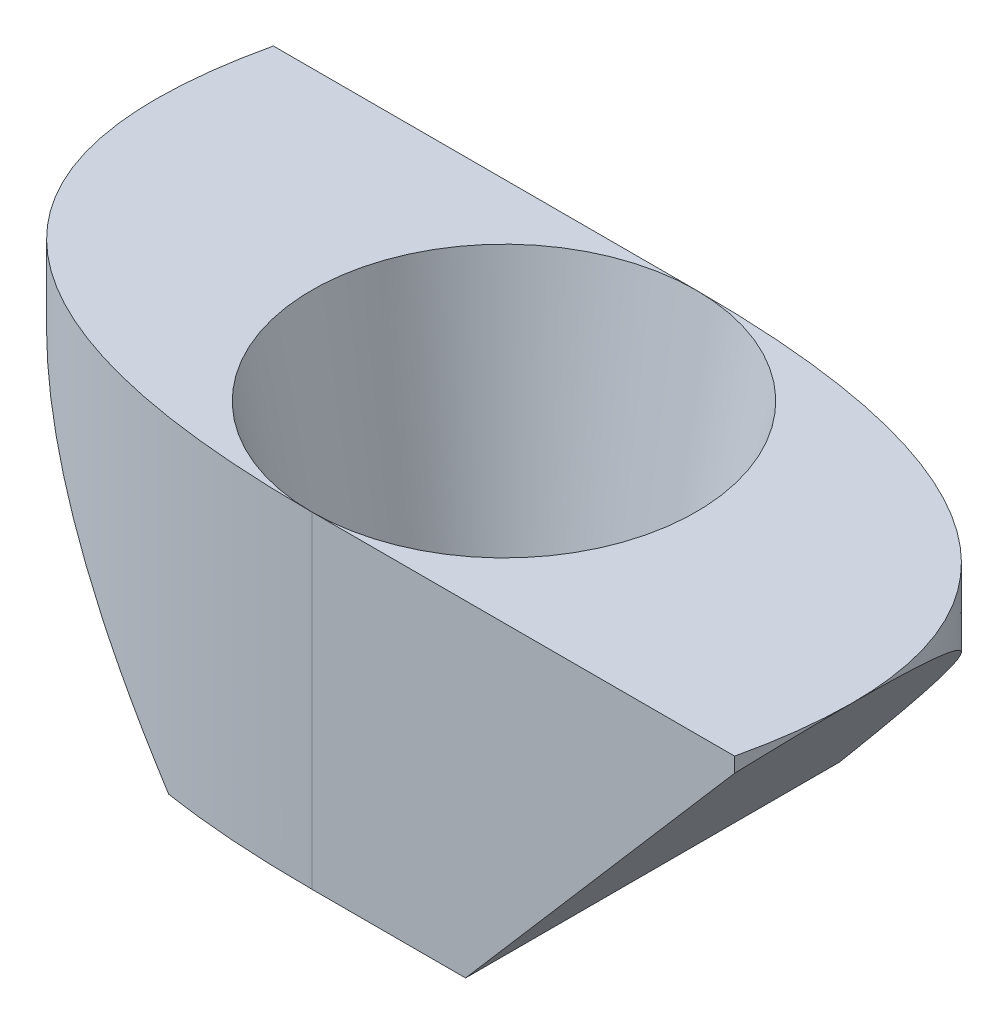
ISO-10303-21;
HEADER;
FILE_DESCRIPTION(('STEP AP214'),'2;1');
FILE_NAME('part.step','',(''),(''),'','','');
FILE_SCHEMA(('AUTOMOTIVE_DESIGN { 1 0 10303 214 1 1 1 1 }'));
ENDSEC;
DATA;
#1=APPLICATION_CONTEXT('core data for automotive mechanical design processes');
#2=APPLICATION_PROTOCOL_DEFINITION('international standard','automotive_design',2000,#1);
#3=PRODUCT_CONTEXT('',#1,'mechanical');
#4=PRODUCT('Part','Part','',(#3));
#5=PRODUCT_RELATED_PRODUCT_CATEGORY('part','',(#4));
#6=PRODUCT_DEFINITION_FORMATION('','',#4);
#7=PRODUCT_DEFINITION_CONTEXT('part definition',#1,'design');
#8=PRODUCT_DEFINITION('design','',#6,#7);
#9=PRODUCT_DEFINITION_SHAPE('','',#8);
#10=(LENGTH_UNIT() NAMED_UNIT(*) SI_UNIT(.MILLI.,.METRE.));
#11=(NAMED_UNIT(*) PLANE_ANGLE_UNIT() SI_UNIT($,.RADIAN.));
#12=(NAMED_UNIT(*) SI_UNIT($,.STERADIAN.) SOLID_ANGLE_UNIT());
#13=UNCERTAINTY_MEASURE_WITH_UNIT(LENGTH_MEASURE(1.E-05),#10,'distance_accuracy_value','');
#14=(GEOMETRIC_REPRESENTATION_CONTEXT(3) GLOBAL_UNCERTAINTY_ASSIGNED_CONTEXT((#13)) GLOBAL_UNIT_ASSIGNED_CONTEXT((#10,
#11,#12)) REPRESENTATION_CONTEXT('',''));
#15=CARTESIAN_POINT('',(0.,0.,0.));
#16=DIRECTION('',(0.,0.,1.));
#17=DIRECTION('',(1.,0.,0.));
#18=AXIS2_PLACEMENT_3D('',#15,#16,#17);
#19=CARTESIAN_POINT('',(1.02364660851406,7.62,-1.58527253873093));
#20=DIRECTION('',(0.,1.,0.));
#21=DIRECTION('',(0.,0.,1.));
#22=AXIS2_PLACEMENT_3D('',#19,#20,#21);
#23=PLANE('',#22);
#24=CARTESIAN_POINT('',(6.985,7.62,-3.175));
#25=DIRECTION('',(0.,1.,0.));
#26=DIRECTION('',(0.,0.,1.));
#27=AXIS2_PLACEMENT_3D('',#24,#25,#26);
#28=CIRCLE('',#27,3.175);
#29=CARTESIAN_POINT('',(6.985,7.62,0.));
#30=VERTEX_POINT('',#29);
#31=CARTESIAN_POINT('',(6.985,7.62,-6.35));
#32=VERTEX_POINT('',#31);
#33=EDGE_CURVE('E102',#30,#32,#28,.T.);
#34=ORIENTED_EDGE('',*,*,#33,.F.);
#35=DIRECTION('',(1.,0.,0.));
#36=VECTOR('',#35,1.);
#37=CARTESIAN_POINT('',(6.985,7.62,0.));
#38=LINE('',#37,#36);
#39=CARTESIAN_POINT('',(13.97,7.62,0.));
#40=VERTEX_POINT('',#39);
#41=EDGE_CURVE('E115',#30,#40,#38,.T.);
#42=ORIENTED_EDGE('',*,*,#41,.T.);
#43=CARTESIAN_POINT('',(6.985,7.62,-6.35));
#44=CARTESIAN_POINT('',(15.4152067829719,7.62,-6.35445492253815));
#45=CARTESIAN_POINT('',(13.97,7.62,0.));
#46=B_SPLINE_CURVE_WITH_KNOTS('',2,(#43,#44,#45),.UNSPECIFIED.,.F.,.F.,(3,3),(0.,1.),.UNSPECIFIED.);
#47=CARTESIAN_POINT('',(14.1814972331641,7.62,-1.72367732330045));
#48=VERTEX_POINT('',#47);
#49=EDGE_CURVE('E149',#48,#40,#46,.T.);
#50=ORIENTED_EDGE('',*,*,#49,.F.);
#51=EDGE_CURVE('E118',#32,#48,#46,.T.);
#52=ORIENTED_EDGE('',*,*,#51,.F.);
#53=EDGE_LOOP('',(#34,#42,#50,#52));
#54=FACE_BOUND('',#53,.T.);
#55=ADVANCED_FACE('F39',(#54),#23,.T.);
#56=CARTESIAN_POINT('',(6.985,7.62,0.));
#57=CARTESIAN_POINT('',(-1.44520678297188,7.62,0.00445492253814571));
#58=CARTESIAN_POINT('',(0.,7.62,-6.35));
#59=B_SPLINE_CURVE_WITH_KNOTS('',2,(#56,#57,#58),.UNSPECIFIED.,.F.,.F.,(3,3),(0.,1.),.UNSPECIFIED.);
#60=DIRECTION('',(0.,-1.,0.));
#61=VECTOR('',#60,1.);
#62=SURFACE_OF_LINEAR_EXTRUSION('',#59,#61);
#63=CARTESIAN_POINT('',(4.4449999999907,2.22250000000322,-0.175813019659384));
#64=CARTESIAN_POINT('',(4.33611285150209,2.34871469627836,-0.192801383492369));
#65=CARTESIAN_POINT('',(4.2273198373901,2.47482027828033,-0.211282842349697));
#66=CARTESIAN_POINT('',(4.00961120651582,2.72717355506995,-0.25166564757652));
#67=CARTESIAN_POINT('',(3.90069654144772,2.85342014671736,-0.273578981611049));
#68=CARTESIAN_POINT('',(3.68298833800999,3.10577292804928,-0.321192206364467));
#69=CARTESIAN_POINT('',(3.57419551608388,3.23187828728039,-0.346899835043656));
#70=CARTESIAN_POINT('',(3.35698480896471,3.48365440417063,-0.402539518381535));
#71=CARTESIAN_POINT('',(3.2485672683031,3.60932476247196,-0.432474743476806));
#72=CARTESIAN_POINT('',(3.03069251355806,3.86187059893477,-0.497576945506983));
#73=CARTESIAN_POINT('',(2.92124447650136,3.98873543970097,-0.532816396972029));
#74=CARTESIAN_POINT('',(2.70326055147626,4.24140781904727,-0.60881780132445));
#75=CARTESIAN_POINT('',(2.59472397227606,4.36721615885703,-0.64957507316884));
#76=CARTESIAN_POINT('',(2.37885733957723,4.61743431461875,-0.737393145668664));
#77=CARTESIAN_POINT('',(2.27152615457931,4.741845442129,-0.784447384936697));
#78=CARTESIAN_POINT('',(2.0583893655255,4.98889934580678,-0.885835805511238));
#79=CARTESIAN_POINT('',(1.95258294852688,5.11154306428313,-0.940165935573852));
#80=CARTESIAN_POINT('',(1.77081844199807,5.32223231735557,-1.04174394035354));
#81=CARTESIAN_POINT('',(1.69439560777923,5.41081655289605,-1.08704103295699));
#82=CARTESIAN_POINT('',(1.54291594039176,5.58640164696649,-1.18276042634278));
#83=CARTESIAN_POINT('',(1.4678592173731,5.67340237781798,-1.23318313826584));
#84=CARTESIAN_POINT('',(1.31950913666771,5.84535986442498,-1.33975475856979));
#85=CARTESIAN_POINT('',(1.24621542517321,5.93031703029078,-1.39590250597795));
#86=CARTESIAN_POINT('',(1.10186525418845,6.09763808920632,-1.51461396658386));
#87=CARTESIAN_POINT('',(1.03080878602798,6.18000199230597,-1.57717765491333));
#88=CARTESIAN_POINT('',(0.89055697007189,6.34257251231648,-1.7104047177679));
#89=CARTESIAN_POINT('',(0.821403641730782,6.42273042308743,-1.78117253361704));
#90=CARTESIAN_POINT('',(0.686898928429221,6.5786392862721,-1.93080787251836));
#91=CARTESIAN_POINT('',(0.621547979361351,6.65438973342831,-2.00967632134664));
#92=CARTESIAN_POINT('',(0.495917245409161,6.80001247355956,-2.175865932437));
#93=CARTESIAN_POINT('',(0.435622606437337,6.86990198439886,-2.26316058987801));
#94=CARTESIAN_POINT('',(0.321157798839941,7.00258192987521,-2.44669797594878));
#95=CARTESIAN_POINT('',(0.266983998264478,7.06537657442554,-2.54293533575892));
#96=CARTESIAN_POINT('',(0.18146110953869,7.16450898421413,-2.7134774073111));
#97=CARTESIAN_POINT('',(0.148186958924518,7.20307815304361,-2.78553005247946));
#98=CARTESIAN_POINT('',(0.0856544563667786,7.27556164560354,-2.93360137460022));
#99=CARTESIAN_POINT('',(0.0563950508124339,7.30947719060909,-3.00961900374553));
#100=CARTESIAN_POINT('',(0.00225209664267992,7.37223608007001,-3.16518378385871));
#101=CARTESIAN_POINT('',(-0.0226333506328952,7.40108162532521,-3.24472938452242));
#102=CARTESIAN_POINT('',(-0.0678025312377718,7.4534387169559,-3.40682987961406));
#103=CARTESIAN_POINT('',(-0.0880861041550688,7.47695007739253,-3.48938487882712));
#104=CARTESIAN_POINT('',(-0.123914413113531,7.51847985566148,-3.65671393622461));
#105=CARTESIAN_POINT('',(-0.139466956832929,7.53650732363196,-3.74148408482895));
#106=CARTESIAN_POINT('',(-0.165916205581268,7.56716552291154,-3.91270038737645));
#107=CARTESIAN_POINT('',(-0.176812932592585,7.57979627970114,-3.9991465334044));
#108=CARTESIAN_POINT('',(-0.194123042906617,7.59986100125935,-4.17316449668132));
#109=CARTESIAN_POINT('',(-0.200531872063575,7.60728968716693,-4.26073736580889));
#110=CARTESIAN_POINT('',(-0.209110690893473,7.61723367989704,-4.43639889542608));
#111=CARTESIAN_POINT('',(-0.211278365156075,7.61974630285085,-4.52448781134119));
#112=CARTESIAN_POINT('',(-0.211785162669914,7.62033374861619,-4.74439763703106));
#113=CARTESIAN_POINT('',(-0.207691896346679,7.615589108198,-4.87623726905798));
#114=CARTESIAN_POINT('',(-0.19186481550894,7.59724341517079,-5.1388506906859));
#115=CARTESIAN_POINT('',(-0.180126125614932,7.58363671134808,-5.26962374623088));
#116=CARTESIAN_POINT('',(-0.150119205945933,7.54885469800124,-5.52945421678254));
#117=CARTESIAN_POINT('',(-0.131846782233135,7.52767452714505,-5.65851047447848));
#118=CARTESIAN_POINT('',(-0.0897792108768285,7.478912613409,-5.91442721480851));
#119=CARTESIAN_POINT('',(-0.0659856555646899,7.45133271625313,-6.04128831922539));
#120=CARTESIAN_POINT('',(-0.027106344513439,7.4062664205181,-6.22827298303603));
#121=CARTESIAN_POINT('',(-0.0138074153761489,7.39085119176906,-6.28927847906629));
#122=CARTESIAN_POINT('',(0.,7.37484655979763,-6.35));
#123=B_SPLINE_CURVE_WITH_KNOTS('',3,(#63,#64,#65,#66,#67,#68,#69,#70,#71,#72,#73,#74,#75,#76,
#77,#78,#79,#80,#81,#82,#83,#84,#85,#86,#87,#88,#89,#90,#91,#92,#93,#94,#95,#96,#97,#98,#99,
#100,#101,#102,#103,#104,#105,#106,#107,#108,#109,#110,#111,#112,#113,#114,#115,#116,#117,#118,
#119,#120,#121,#122),.UNSPECIFIED.,.F.,.F.,(4,2,2,2,2,2,2,2,2,2,2,2,2,2,2,2,2,2,2,2,2,2,2,2,2,2,
2,2,2,4),(0.,0.502674562163052,1.00714584520608,1.51266052175297,2.01855633638888,
2.53212633488433,3.04526334497855,3.55786977439832,4.07019196017935,4.44646021362518,
4.82275867248424,5.19898097344792,5.57520181622328,5.95688683527895,6.33861552362211,
6.71918035088728,7.09951816136753,7.36396634879362,7.62834500240083,7.89260860881417,
8.1568814255059,8.42071571324087,8.68454875527207,8.9486491384505,9.21289366404602,
9.60820991462832,10.0037784999898,10.3996014539869,10.7953103915663,10.9882172906008),.UNSPECIFIED.);
#124=CARTESIAN_POINT('',(4.445,2.2225,-0.175813019658626));
#125=VERTEX_POINT('',#124);
#126=CARTESIAN_POINT('',(-0.211497233164059,7.62,-4.62632267670126));
#127=VERTEX_POINT('',#126);
#128=EDGE_CURVE('E189',#125,#127,#123,.T.);
#129=ORIENTED_EDGE('',*,*,#128,.F.);
#130=CARTESIAN_POINT('',(6.985,2.2225,0.));
#131=CARTESIAN_POINT('',(-1.44520678297188,2.2225,0.00445492253814571));
#132=CARTESIAN_POINT('',(0.,2.2225,-6.35));
#133=B_SPLINE_CURVE_WITH_KNOTS('',2,(#130,#131,#132),.UNSPECIFIED.,.F.,.F.,(3,3),(0.,1.),.UNSPECIFIED.);
#134=CARTESIAN_POINT('',(6.985,2.2225,0.));
#135=VERTEX_POINT('',#134);
#136=EDGE_CURVE('E131',#135,#125,#133,.T.);
#137=ORIENTED_EDGE('',*,*,#136,.F.);
#138=DIRECTION('',(0.,-1.,0.));
#139=VECTOR('',#138,1.);
#140=CARTESIAN_POINT('',(6.985,7.62,0.));
#141=LINE('',#140,#139);
#142=EDGE_CURVE('E126',#30,#135,#141,.T.);
#143=ORIENTED_EDGE('',*,*,#142,.F.);
#144=EDGE_CURVE('E129',#30,#127,#59,.T.);
#145=ORIENTED_EDGE('',*,*,#144,.T.);
#146=EDGE_LOOP('',(#129,#137,#143,#145));
#147=FACE_BOUND('',#146,.T.);
#148=ADVANCED_FACE('F128',(#147),#62,.T.);
#149=DIRECTION('',(0.,-1.,0.));
#150=VECTOR('',#149,1.);
#151=SURFACE_OF_LINEAR_EXTRUSION('',#46,#150);
#152=CARTESIAN_POINT('',(9.52500000000929,2.22250000000322,-6.17418698034061));
#153=CARTESIAN_POINT('',(9.63388714849791,2.34871469627836,-6.15719861650763));
#154=CARTESIAN_POINT('',(9.7426801626099,2.47482027828033,-6.1387171576503));
#155=CARTESIAN_POINT('',(9.96038879348418,2.72717355506994,-6.09833435242348));
#156=CARTESIAN_POINT('',(10.0693034585523,2.85342014671736,-6.07642101838895));
#157=CARTESIAN_POINT('',(10.28701166199,3.10577292804928,-6.02880779363553));
#158=CARTESIAN_POINT('',(10.3958044839161,3.23187828728038,-6.00310016495634));
#159=CARTESIAN_POINT('',(10.6130151910353,3.48365440417063,-5.94746048161846));
#160=CARTESIAN_POINT('',(10.7214327316969,3.60932476247195,-5.91752525652319));
#161=CARTESIAN_POINT('',(10.9393074864419,3.86187059893477,-5.85242305449302));
#162=CARTESIAN_POINT('',(11.0487555234986,3.98873543970097,-5.81718360302797));
#163=CARTESIAN_POINT('',(11.2667394485237,4.24140781904727,-5.74118219867555));
#164=CARTESIAN_POINT('',(11.3752760277239,4.36721615885702,-5.70042492683116));
#165=CARTESIAN_POINT('',(11.5911426604228,4.61743431461875,-5.61260685433133));
#166=CARTESIAN_POINT('',(11.6984738454207,4.741845442129,-5.5655526150633));
#167=CARTESIAN_POINT('',(11.9116106344745,4.98889934580678,-5.46416419448876));
#168=CARTESIAN_POINT('',(12.0174170514731,5.11154306428313,-5.40983406442615));
#169=CARTESIAN_POINT('',(12.1991815580019,5.32223231735556,-5.30825605964646));
#170=CARTESIAN_POINT('',(12.2756043922208,5.41081655289604,-5.26295896704301));
#171=CARTESIAN_POINT('',(12.4270840596082,5.58640164696648,-5.16723957365721));
#172=CARTESIAN_POINT('',(12.5021407826269,5.67340237781798,-5.11681686173416));
#173=CARTESIAN_POINT('',(12.6504908633323,5.84535986442498,-5.0102452414302));
#174=CARTESIAN_POINT('',(12.7237845748268,5.93031703029077,-4.95409749402205));
#175=CARTESIAN_POINT('',(12.8681347458115,6.09763808920631,-4.83538603341614));
#176=CARTESIAN_POINT('',(12.939191213972,6.18000199230597,-4.77282234508666));
#177=CARTESIAN_POINT('',(13.0794430299281,6.34257251231648,-4.63959528223209));
#178=CARTESIAN_POINT('',(13.1485963582692,6.42273042308742,-4.56882746638296));
#179=CARTESIAN_POINT('',(13.2831010715708,6.5786392862721,-4.41919212748164));
#180=CARTESIAN_POINT('',(13.3484520206386,6.65438973342831,-4.34032367865336));
#181=CARTESIAN_POINT('',(13.4740827545908,6.80001247355955,-4.17413406756299));
#182=CARTESIAN_POINT('',(13.5343773935627,6.86990198439886,-4.08683941012199));
#183=CARTESIAN_POINT('',(13.6488422011601,7.00258192987521,-3.90330202405122));
#184=CARTESIAN_POINT('',(13.7030160017355,7.06537657442554,-3.80706466424108));
#185=CARTESIAN_POINT('',(13.7885388904613,7.16450898421412,-3.6365225926889));
#186=CARTESIAN_POINT('',(13.8218130410755,7.20307815304361,-3.56446994752054));
#187=CARTESIAN_POINT('',(13.8843455436332,7.27556164560353,-3.41639862539978));
#188=CARTESIAN_POINT('',(13.9136049491876,7.30947719060908,-3.34038099625448));
#189=CARTESIAN_POINT('',(13.9677479033573,7.37223608007001,-3.18481621614129));
#190=CARTESIAN_POINT('',(13.9926333506329,7.4010816253252,-3.10527061547758));
#191=CARTESIAN_POINT('',(14.0378025312378,7.45343871695589,-2.94317012038594));
#192=CARTESIAN_POINT('',(14.0580861041551,7.47695007739252,-2.86061512117288));
#193=CARTESIAN_POINT('',(14.0939144131135,7.51847985566148,-2.69328606377539));
#194=CARTESIAN_POINT('',(14.1094669568329,7.53650732363195,-2.60851591517105));
#195=CARTESIAN_POINT('',(14.1359162055813,7.56716552291153,-2.43729961262354));
#196=CARTESIAN_POINT('',(14.1468129325926,7.57979627970114,-2.35085346659559));
#197=CARTESIAN_POINT('',(14.1641230429066,7.59986100125934,-2.17683550331867));
#198=CARTESIAN_POINT('',(14.1705318720636,7.60728968716692,-2.08926263419111));
#199=CARTESIAN_POINT('',(14.1791106908935,7.61723367989704,-1.91360110457392));
#200=CARTESIAN_POINT('',(14.1812783651561,7.61974630285084,-1.82551218865881));
#201=CARTESIAN_POINT('',(14.1817851626699,7.62033374861619,-1.60560236296894));
#202=CARTESIAN_POINT('',(14.1776918963467,7.615589108198,-1.47376273094202));
#203=CARTESIAN_POINT('',(14.1618648155089,7.59724341517078,-1.2111493093141));
#204=CARTESIAN_POINT('',(14.1501261256149,7.58363671134808,-1.08037625376912));
#205=CARTESIAN_POINT('',(14.1201192059459,7.54885469800124,-0.820545783217458));
#206=CARTESIAN_POINT('',(14.1018467822331,7.52767452714504,-0.691489525521519));
#207=CARTESIAN_POINT('',(14.0597792108768,7.478912613409,-0.435572785191489));
#208=CARTESIAN_POINT('',(14.0359856555647,7.45133271625313,-0.308711680774611));
#209=CARTESIAN_POINT('',(13.9971063445134,7.4062664205181,-0.121727016963965));
#210=CARTESIAN_POINT('',(13.9838074153761,7.39085119176905,-0.0607215209337079));
#211=CARTESIAN_POINT('',(13.97,7.37484655979763,0.));
#212=B_SPLINE_CURVE_WITH_KNOTS('',3,(#152,#153,#154,#155,#156,#157,#158,#159,#160,#161,#162,
#163,#164,#165,#166,#167,#168,#169,#170,#171,#172,#173,#174,#175,#176,#177,#178,#179,#180,#181,
#182,#183,#184,#185,#186,#187,#188,#189,#190,#191,#192,#193,#194,#195,#196,#197,#198,#199,#200,
#201,#202,#203,#204,#205,#206,#207,#208,#209,#210,#211),.UNSPECIFIED.,.F.,.F.,(4,2,2,2,2,2,2,2,
2,2,2,2,2,2,2,2,2,2,2,2,2,2,2,2,2,2,2,2,2,4),(0.,0.502674562163052,1.00714584520608,
1.51266052175298,2.01855633638888,2.53212633488433,3.04526334497855,3.55786977439833,
4.07019196017935,4.44646021362518,4.82275867248424,5.19898097344792,5.57520181622328,
5.95688683527894,6.33861552362211,6.71918035088728,7.09951816136752,7.36396634879362,
7.62834500240083,7.89260860881417,8.1568814255059,8.42071571324087,8.68454875527207,
8.9486491384505,9.21289366404602,9.60820991462832,10.0037784999898,10.3996014539869,
10.7953103915663,10.9882172906008),.UNSPECIFIED.);
#213=CARTESIAN_POINT('',(9.525,2.2225,-6.17418698034138));
#214=VERTEX_POINT('',#213);
#215=EDGE_CURVE('E188',#214,#48,#212,.T.);
#216=ORIENTED_EDGE('',*,*,#215,.F.);
#217=CARTESIAN_POINT('',(6.985,2.2225,-6.35));
#218=CARTESIAN_POINT('',(15.4152067829719,2.2225,-6.35445492253815));
#219=CARTESIAN_POINT('',(13.97,2.2225,0.));
#220=B_SPLINE_CURVE_WITH_KNOTS('',2,(#217,#218,#219),.UNSPECIFIED.,.F.,.F.,(3,3),(0.,1.),.UNSPECIFIED.);
#221=CARTESIAN_POINT('',(6.985,2.2225,-6.35));
#222=VERTEX_POINT('',#221);
#223=EDGE_CURVE('E197',#222,#214,#220,.T.);
#224=ORIENTED_EDGE('',*,*,#223,.F.);
#225=DIRECTION('',(0.,-1.,0.));
#226=VECTOR('',#225,1.);
#227=CARTESIAN_POINT('',(6.985,7.62,-6.35));
#228=LINE('',#227,#226);
#229=EDGE_CURVE('E257',#32,#222,#228,.T.);
#230=ORIENTED_EDGE('',*,*,#229,.F.);
#231=ORIENTED_EDGE('',*,*,#51,.T.);
#232=EDGE_LOOP('',(#216,#224,#230,#231));
#233=FACE_BOUND('',#232,.T.);
#234=ADVANCED_FACE('F176',(#233),#151,.T.);
#235=CARTESIAN_POINT('',(0.,7.37484655979763,-6.35));
#236=VERTEX_POINT('',#235);
#237=EDGE_CURVE('E190',#127,#236,#123,.T.);
#238=ORIENTED_EDGE('',*,*,#237,.F.);
#239=CARTESIAN_POINT('',(0.,7.62,-6.35));
#240=VERTEX_POINT('',#239);
#241=EDGE_CURVE('E144',#127,#240,#59,.T.);
#242=ORIENTED_EDGE('',*,*,#241,.T.);
#243=DIRECTION('',(0.,-1.,0.));
#244=VECTOR('',#243,1.);
#245=CARTESIAN_POINT('',(0.,7.62,-6.35));
#246=LINE('',#245,#244);
#247=EDGE_CURVE('E140',#240,#236,#246,.T.);
#248=ORIENTED_EDGE('',*,*,#247,.T.);
#249=EDGE_LOOP('',(#238,#242,#248));
#250=FACE_BOUND('',#249,.T.);
#251=ADVANCED_FACE('F41',(#250),#62,.T.);
#252=CARTESIAN_POINT('',(6.985,7.62,0.));
#253=DIRECTION('',(0.,0.,-1.));
#254=DIRECTION('',(-1.,0.,0.));
#255=AXIS2_PLACEMENT_3D('',#252,#253,#254);
#256=PLANE('',#255);
#257=DIRECTION('',(1.,0.,0.));
#258=VECTOR('',#257,1.);
#259=CARTESIAN_POINT('',(6.985,2.2225,0.));
#260=LINE('',#259,#258);
#261=CARTESIAN_POINT('',(9.525,2.2225,0.));
#262=VERTEX_POINT('',#261);
#263=EDGE_CURVE('E252',#135,#262,#260,.T.);
#264=ORIENTED_EDGE('',*,*,#263,.T.);
#265=DIRECTION('',(-0.653219630367065,-0.757168484885045,0.));
#266=VECTOR('',#265,1.);
#267=CARTESIAN_POINT('',(9.525,2.2225,0.));
#268=LINE('',#267,#266);
#269=CARTESIAN_POINT('',(13.97,7.37484655979763,0.));
#270=VERTEX_POINT('',#269);
#271=EDGE_CURVE('E57',#270,#262,#268,.T.);
#272=ORIENTED_EDGE('',*,*,#271,.F.);
#273=DIRECTION('',(0.,-1.,0.));
#274=VECTOR('',#273,1.);
#275=CARTESIAN_POINT('',(13.97,7.62,0.));
#276=LINE('',#275,#274);
#277=EDGE_CURVE('E135',#40,#270,#276,.T.);
#278=ORIENTED_EDGE('',*,*,#277,.F.);
#279=ORIENTED_EDGE('',*,*,#41,.F.);
#280=ORIENTED_EDGE('',*,*,#142,.T.);
#281=EDGE_LOOP('',(#264,#272,#278,#279,#280));
#282=FACE_BOUND('',#281,.T.);
#283=ADVANCED_FACE('F137',(#282),#256,.F.);
#284=EDGE_CURVE('E179',#48,#270,#212,.T.);
#285=ORIENTED_EDGE('',*,*,#284,.F.);
#286=ORIENTED_EDGE('',*,*,#49,.T.);
#287=ORIENTED_EDGE('',*,*,#277,.T.);
#288=EDGE_LOOP('',(#285,#286,#287));
#289=FACE_BOUND('',#288,.T.);
#290=ADVANCED_FACE('F170',(#289),#151,.T.);
#291=CARTESIAN_POINT('',(0.,7.62,-6.35));
#292=DIRECTION('',(0.,0.,-1.));
#293=DIRECTION('',(-1.,0.,0.));
#294=AXIS2_PLACEMENT_3D('',#291,#292,#293);
#295=PLANE('',#294);
#296=DIRECTION('',(-0.653219630367065,0.757168484885045,0.));
#297=VECTOR('',#296,1.);
#298=CARTESIAN_POINT('',(4.445,2.2225,-6.35));
#299=LINE('',#298,#297);
#300=CARTESIAN_POINT('',(4.445,2.2225,-6.35));
#301=VERTEX_POINT('',#300);
#302=EDGE_CURVE('E64',#301,#236,#299,.T.);
#303=ORIENTED_EDGE('',*,*,#302,.T.);
#304=ORIENTED_EDGE('',*,*,#247,.F.);
#305=DIRECTION('',(1.,0.,0.));
#306=VECTOR('',#305,1.);
#307=CARTESIAN_POINT('',(0.,7.62,-6.35));
#308=LINE('',#307,#306);
#309=EDGE_CURVE('E146',#240,#32,#308,.T.);
#310=ORIENTED_EDGE('',*,*,#309,.T.);
#311=ORIENTED_EDGE('',*,*,#229,.T.);
#312=DIRECTION('',(1.,0.,0.));
#313=VECTOR('',#312,1.);
#314=CARTESIAN_POINT('',(0.,2.2225,-6.35));
#315=LINE('',#314,#313);
#316=EDGE_CURVE('E50',#301,#222,#315,.T.);
#317=ORIENTED_EDGE('',*,*,#316,.F.);
#318=EDGE_LOOP('',(#303,#304,#310,#311,#317));
#319=FACE_BOUND('',#318,.T.);
#320=ADVANCED_FACE('F174',(#319),#295,.T.);
#321=EDGE_CURVE('E99',#32,#30,#28,.T.);
#322=ORIENTED_EDGE('',*,*,#321,.F.);
#323=ORIENTED_EDGE('',*,*,#309,.F.);
#324=ORIENTED_EDGE('',*,*,#241,.F.);
#325=ORIENTED_EDGE('',*,*,#144,.F.);
#326=EDGE_LOOP('',(#322,#323,#324,#325));
#327=FACE_BOUND('',#326,.T.);
#328=ADVANCED_FACE('F143',(#327),#23,.T.);
#329=CARTESIAN_POINT('',(0.,2.2225,0.));
#330=DIRECTION('',(0.,1.,0.));
#331=DIRECTION('',(0.,0.,1.));
#332=AXIS2_PLACEMENT_3D('',#329,#330,#331);
#333=PLANE('',#332);
#334=CARTESIAN_POINT('',(6.985,2.2225,-3.175));
#335=DIRECTION('',(0.,1.,0.));
#336=DIRECTION('',(0.,0.,1.));
#337=AXIS2_PLACEMENT_3D('',#334,#335,#336);
#338=CIRCLE('',#337,2.22327512162606);
#339=CARTESIAN_POINT('',(6.985,2.2225,-0.951724878373942));
#340=VERTEX_POINT('',#339);
#341=EDGE_CURVE('E121',#340,#340,#338,.F.);
#342=ORIENTED_EDGE('',*,*,#341,.F.);
#343=EDGE_LOOP('',(#342));
#344=FACE_BOUND('',#343,.T.);
#345=ORIENTED_EDGE('',*,*,#223,.T.);
#346=DIRECTION('',(0.,0.,1.));
#347=VECTOR('',#346,1.);
#348=CARTESIAN_POINT('',(9.525,2.2225,0.));
#349=LINE('',#348,#347);
#350=EDGE_CURVE('E11',#214,#262,#349,.T.);
#351=ORIENTED_EDGE('',*,*,#350,.T.);
#352=ORIENTED_EDGE('',*,*,#263,.F.);
#353=ORIENTED_EDGE('',*,*,#136,.T.);
#354=DIRECTION('',(0.,0.,1.));
#355=VECTOR('',#354,1.);
#356=CARTESIAN_POINT('',(4.445,2.2225,-13.4785322986197));
#357=LINE('',#356,#355);
#358=EDGE_CURVE('E237',#301,#125,#357,.T.);
#359=ORIENTED_EDGE('',*,*,#358,.F.);
#360=ORIENTED_EDGE('',*,*,#316,.T.);
#361=EDGE_LOOP('',(#345,#351,#352,#353,#359,#360));
#362=FACE_BOUND('',#361,.T.);
#363=ADVANCED_FACE('F208',(#344,#362),#333,.F.);
#364=CARTESIAN_POINT('',(4.445,2.2225,-13.4785322986197));
#365=DIRECTION('',(0.757168484885045,0.653219630367065,0.));
#366=DIRECTION('',(-0.653219630367065,0.757168484885045,0.));
#367=AXIS2_PLACEMENT_3D('',#364,#365,#366);
#368=PLANE('',#367);
#369=ORIENTED_EDGE('',*,*,#128,.T.);
#370=ORIENTED_EDGE('',*,*,#237,.T.);
#371=ORIENTED_EDGE('',*,*,#302,.F.);
#372=ORIENTED_EDGE('',*,*,#358,.T.);
#373=EDGE_LOOP('',(#369,#370,#371,#372));
#374=FACE_BOUND('',#373,.T.);
#375=ADVANCED_FACE('F204',(#374),#368,.F.);
#376=CARTESIAN_POINT('',(9.525,2.2225,-13.4785322986197));
#377=DIRECTION('',(-0.757168484885045,0.653219630367065,0.));
#378=DIRECTION('',(-0.653219630367065,-0.757168484885045,0.));
#379=AXIS2_PLACEMENT_3D('',#376,#377,#378);
#380=PLANE('',#379);
#381=ORIENTED_EDGE('',*,*,#215,.T.);
#382=ORIENTED_EDGE('',*,*,#284,.T.);
#383=ORIENTED_EDGE('',*,*,#271,.T.);
#384=ORIENTED_EDGE('',*,*,#350,.F.);
#385=EDGE_LOOP('',(#381,#382,#383,#384));
#386=FACE_BOUND('',#385,.T.);
#387=ADVANCED_FACE('F200',(#386),#380,.F.);
#388=CARTESIAN_POINT('',(6.985,7.62,-3.175));
#389=DIRECTION('',(0.,1.,0.));
#390=DIRECTION('',(0.,0.,1.));
#391=AXIS2_PLACEMENT_3D('',#388,#389,#390);
#392=CONICAL_SURFACE('',#391,3.175,0.174532925199433);
#393=ORIENTED_EDGE('',*,*,#341,.T.);
#394=EDGE_LOOP('',(#393));
#395=FACE_BOUND('',#394,.T.);
#396=ORIENTED_EDGE('',*,*,#33,.T.);
#397=ORIENTED_EDGE('',*,*,#321,.T.);
#398=EDGE_LOOP('',(#396,#397));
#399=FACE_BOUND('',#398,.T.);
#400=ADVANCED_FACE('F101',(#395,#399),#392,.F.);
#401=CLOSED_SHELL('',(#55,#148,#234,#251,#283,#290,#320,#328,#363,#375,#387,#400));
#402=MANIFOLD_SOLID_BREP('B2',#401);
#403=ADVANCED_BREP_SHAPE_REPRESENTATION('',(#18,#402),#14);
#404=SHAPE_DEFINITION_REPRESENTATION(#9,#403);
ENDSEC;
END-ISO-10303-21;
